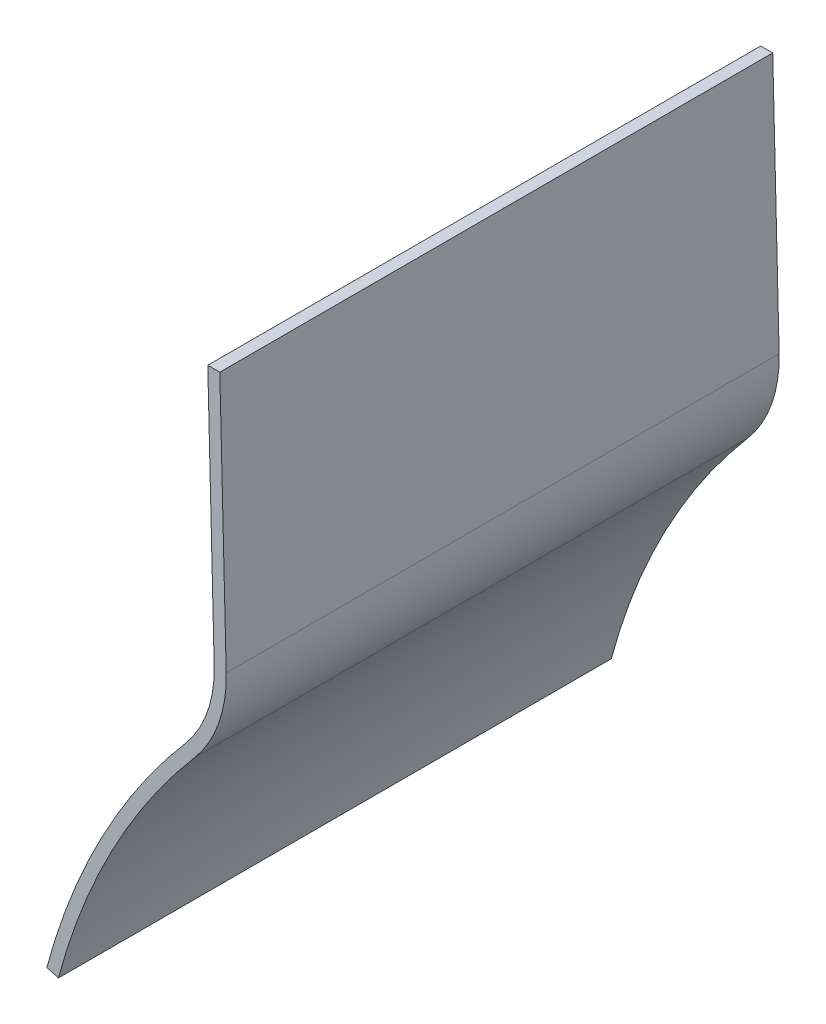
ISO-10303-21;
HEADER;
FILE_DESCRIPTION(('STEP AP214'),'2;1');
FILE_NAME('part.step','',(''),(''),'','','');
FILE_SCHEMA(('AUTOMOTIVE_DESIGN { 1 0 10303 214 1 1 1 1 }'));
ENDSEC;
DATA;
#1=APPLICATION_CONTEXT('core data for automotive mechanical design processes');
#2=APPLICATION_PROTOCOL_DEFINITION('international standard','automotive_design',2000,#1);
#3=PRODUCT_CONTEXT('',#1,'mechanical');
#4=PRODUCT('Part','Part','',(#3));
#5=PRODUCT_RELATED_PRODUCT_CATEGORY('part','',(#4));
#6=PRODUCT_DEFINITION_FORMATION('','',#4);
#7=PRODUCT_DEFINITION_CONTEXT('part definition',#1,'design');
#8=PRODUCT_DEFINITION('design','',#6,#7);
#9=PRODUCT_DEFINITION_SHAPE('','',#8);
#10=(LENGTH_UNIT() NAMED_UNIT(*) SI_UNIT(.MILLI.,.METRE.));
#11=(NAMED_UNIT(*) PLANE_ANGLE_UNIT() SI_UNIT($,.RADIAN.));
#12=(NAMED_UNIT(*) SI_UNIT($,.STERADIAN.) SOLID_ANGLE_UNIT());
#13=UNCERTAINTY_MEASURE_WITH_UNIT(LENGTH_MEASURE(1.E-05),#10,'distance_accuracy_value','');
#14=(GEOMETRIC_REPRESENTATION_CONTEXT(3) GLOBAL_UNCERTAINTY_ASSIGNED_CONTEXT((#13)) GLOBAL_UNIT_ASSIGNED_CONTEXT((#10,
#11,#12)) REPRESENTATION_CONTEXT('',''));
#15=CARTESIAN_POINT('',(0.,0.,0.));
#16=DIRECTION('',(0.,0.,1.));
#17=DIRECTION('',(1.,0.,0.));
#18=AXIS2_PLACEMENT_3D('',#15,#16,#17);
#19=CARTESIAN_POINT('',(3079.9311420539,1803.29085628312,460.));
#20=DIRECTION('',(0.,0.,-1.));
#21=DIRECTION('',(-1.,0.,0.));
#22=AXIS2_PLACEMENT_3D('',#19,#20,#21);
#23=CYLINDRICAL_SURFACE('',#22,549.387659983749);
#24=CARTESIAN_POINT('',(3079.9311420539,1803.29085628312,0.));
#25=DIRECTION('',(0.,0.,-1.));
#26=DIRECTION('',(1.,0.,0.));
#27=AXIS2_PLACEMENT_3D('',#24,#25,#26);
#28=CIRCLE('',#27,549.387659983749);
#29=CARTESIAN_POINT('',(2549.10079832221,1944.8745669144,0.));
#30=VERTEX_POINT('',#29);
#31=CARTESIAN_POINT('',(2662.36569843275,2160.31452669713,0.));
#32=VERTEX_POINT('',#31);
#33=EDGE_CURVE('E113',#30,#32,#28,.T.);
#34=ORIENTED_EDGE('',*,*,#33,.T.);
#35=DIRECTION('',(0.,0.,-1.));
#36=VECTOR('',#35,1.);
#37=CARTESIAN_POINT('',(2662.36569843275,2160.31452669713,460.));
#38=LINE('',#37,#36);
#39=CARTESIAN_POINT('',(2662.36569843275,2160.31452669713,460.));
#40=VERTEX_POINT('',#39);
#41=EDGE_CURVE('E11',#40,#32,#38,.T.);
#42=ORIENTED_EDGE('',*,*,#41,.F.);
#43=CARTESIAN_POINT('',(3079.9311420539,1803.29085628312,460.));
#44=DIRECTION('',(0.,0.,-1.));
#45=DIRECTION('',(1.,0.,0.));
#46=AXIS2_PLACEMENT_3D('',#43,#44,#45);
#47=CIRCLE('',#46,549.387659983749);
#48=CARTESIAN_POINT('',(2549.10079832221,1944.8745669144,460.));
#49=VERTEX_POINT('',#48);
#50=EDGE_CURVE('E127',#49,#40,#47,.T.);
#51=ORIENTED_EDGE('',*,*,#50,.F.);
#52=DIRECTION('',(0.,0.,-1.));
#53=VECTOR('',#52,1.);
#54=CARTESIAN_POINT('',(2549.10079832221,1944.8745669144,460.));
#55=LINE('',#54,#53);
#56=EDGE_CURVE('E109',#49,#30,#55,.T.);
#57=ORIENTED_EDGE('',*,*,#56,.T.);
#58=EDGE_LOOP('',(#34,#42,#51,#57));
#59=FACE_BOUND('',#58,.T.);
#60=ADVANCED_FACE('F17',(#59),#23,.F.);
#61=CARTESIAN_POINT('',(2578.85260970876,2231.71926078022,460.));
#62=DIRECTION('',(0.,0.,-1.));
#63=DIRECTION('',(-1.,0.,0.));
#64=AXIS2_PLACEMENT_3D('',#61,#62,#63);
#65=CYLINDRICAL_SURFACE('',#64,109.877531996749);
#66=CARTESIAN_POINT('',(2578.85260970876,2231.71926078022,0.));
#67=DIRECTION('',(0.,0.,1.));
#68=DIRECTION('',(1.,0.,0.));
#69=AXIS2_PLACEMENT_3D('',#66,#67,#68);
#70=CIRCLE('',#69,109.877531996749);
#71=CARTESIAN_POINT('',(2688.69602440583,2234.45719529106,0.));
#72=VERTEX_POINT('',#71);
#73=EDGE_CURVE('E116',#32,#72,#70,.T.);
#74=ORIENTED_EDGE('',*,*,#73,.T.);
#75=DIRECTION('',(0.,0.,-1.));
#76=VECTOR('',#75,1.);
#77=CARTESIAN_POINT('',(2688.69602440583,2234.45719529106,460.));
#78=LINE('',#77,#76);
#79=CARTESIAN_POINT('',(2688.69602440583,2234.45719529106,460.));
#80=VERTEX_POINT('',#79);
#81=EDGE_CURVE('E25',#80,#72,#78,.T.);
#82=ORIENTED_EDGE('',*,*,#81,.F.);
#83=CARTESIAN_POINT('',(2578.85260970876,2231.71926078022,460.));
#84=DIRECTION('',(0.,0.,1.));
#85=DIRECTION('',(1.,0.,0.));
#86=AXIS2_PLACEMENT_3D('',#83,#84,#85);
#87=CIRCLE('',#86,109.877531996749);
#88=EDGE_CURVE('E76',#40,#80,#87,.T.);
#89=ORIENTED_EDGE('',*,*,#88,.F.);
#90=ORIENTED_EDGE('',*,*,#41,.T.);
#91=EDGE_LOOP('',(#74,#82,#89,#90));
#92=FACE_BOUND('',#91,.T.);
#93=ADVANCED_FACE('F162',(#92),#65,.T.);
#94=CARTESIAN_POINT('',(2683.36118481554,2448.48605359148,460.));
#95=DIRECTION('',(-0.99968949703305,-0.0249180561402349,0.));
#96=DIRECTION('',(0.0249180561402349,-0.99968949703305,0.));
#97=AXIS2_PLACEMENT_3D('',#94,#95,#96);
#98=PLANE('',#97);
#99=DIRECTION('',(-0.0249180561402349,0.99968949703305,0.));
#100=VECTOR('',#99,1.);
#101=CARTESIAN_POINT('',(2683.36118481554,2448.48605359148,0.));
#102=LINE('',#101,#100);
#103=CARTESIAN_POINT('',(2683.36118481554,2448.48605359148,0.));
#104=VERTEX_POINT('',#103);
#105=EDGE_CURVE('E118',#72,#104,#102,.T.);
#106=ORIENTED_EDGE('',*,*,#105,.T.);
#107=DIRECTION('',(0.,0.,-1.));
#108=VECTOR('',#107,1.);
#109=CARTESIAN_POINT('',(2683.36118481554,2448.48605359148,460.));
#110=LINE('',#109,#108);
#111=CARTESIAN_POINT('',(2683.36118481554,2448.48605359148,460.));
#112=VERTEX_POINT('',#111);
#113=EDGE_CURVE('E134',#112,#104,#110,.T.);
#114=ORIENTED_EDGE('',*,*,#113,.F.);
#115=DIRECTION('',(-0.0249180561402349,0.99968949703305,0.));
#116=VECTOR('',#115,1.);
#117=CARTESIAN_POINT('',(2683.36118481554,2448.48605359148,460.));
#118=LINE('',#117,#116);
#119=EDGE_CURVE('E142',#80,#112,#118,.T.);
#120=ORIENTED_EDGE('',*,*,#119,.F.);
#121=ORIENTED_EDGE('',*,*,#81,.T.);
#122=EDGE_LOOP('',(#106,#114,#120,#121));
#123=FACE_BOUND('',#122,.T.);
#124=ADVANCED_FACE('F140',(#123),#98,.F.);
#125=CARTESIAN_POINT('',(2673.35807882145,2448.48605359148,460.));
#126=DIRECTION('',(0.,-1.,0.));
#127=DIRECTION('',(0.,0.,-1.));
#128=AXIS2_PLACEMENT_3D('',#125,#126,#127);
#129=PLANE('',#128);
#130=DIRECTION('',(-1.,0.,0.));
#131=VECTOR('',#130,1.);
#132=CARTESIAN_POINT('',(2673.35807882145,2448.48605359148,0.));
#133=LINE('',#132,#131);
#134=CARTESIAN_POINT('',(2673.35807882145,2448.48605359148,0.));
#135=VERTEX_POINT('',#134);
#136=EDGE_CURVE('E120',#104,#135,#133,.T.);
#137=ORIENTED_EDGE('',*,*,#136,.T.);
#138=DIRECTION('',(0.,0.,-1.));
#139=VECTOR('',#138,1.);
#140=CARTESIAN_POINT('',(2673.35807882145,2448.48605359148,460.));
#141=LINE('',#140,#139);
#142=CARTESIAN_POINT('',(2673.35807882145,2448.48605359148,460.));
#143=VERTEX_POINT('',#142);
#144=EDGE_CURVE('E131',#143,#135,#141,.T.);
#145=ORIENTED_EDGE('',*,*,#144,.F.);
#146=DIRECTION('',(-1.,0.,0.));
#147=VECTOR('',#146,1.);
#148=CARTESIAN_POINT('',(2673.35807882145,2448.48605359148,460.));
#149=LINE('',#148,#147);
#150=EDGE_CURVE('E154',#112,#143,#149,.T.);
#151=ORIENTED_EDGE('',*,*,#150,.F.);
#152=ORIENTED_EDGE('',*,*,#113,.T.);
#153=EDGE_LOOP('',(#137,#145,#151,#152));
#154=FACE_BOUND('',#153,.T.);
#155=ADVANCED_FACE('F150',(#154),#129,.F.);
#156=CARTESIAN_POINT('',(2673.35807882145,2448.48605359148,460.));
#157=DIRECTION('',(0.99968949703305,0.0249180561402345,0.));
#158=DIRECTION('',(-0.0249180561402345,0.99968949703305,0.));
#159=AXIS2_PLACEMENT_3D('',#156,#157,#158);
#160=PLANE('',#159);
#161=DIRECTION('',(0.0249180561402345,-0.99968949703305,0.));
#162=VECTOR('',#161,1.);
#163=CARTESIAN_POINT('',(2673.35807882145,2448.48605359148,0.));
#164=LINE('',#163,#162);
#165=CARTESIAN_POINT('',(2678.69912943549,2234.20801472966,0.));
#166=VERTEX_POINT('',#165);
#167=EDGE_CURVE('E122',#135,#166,#164,.T.);
#168=ORIENTED_EDGE('',*,*,#167,.T.);
#169=DIRECTION('',(0.,0.,-1.));
#170=VECTOR('',#169,1.);
#171=CARTESIAN_POINT('',(2678.69912943549,2234.20801472966,460.));
#172=LINE('',#171,#170);
#173=CARTESIAN_POINT('',(2678.69912943549,2234.20801472966,460.));
#174=VERTEX_POINT('',#173);
#175=EDGE_CURVE('E104',#174,#166,#172,.T.);
#176=ORIENTED_EDGE('',*,*,#175,.F.);
#177=DIRECTION('',(0.0249180561402345,-0.99968949703305,0.));
#178=VECTOR('',#177,1.);
#179=CARTESIAN_POINT('',(2673.35807882145,2448.48605359148,460.));
#180=LINE('',#179,#178);
#181=EDGE_CURVE('E95',#143,#174,#180,.T.);
#182=ORIENTED_EDGE('',*,*,#181,.F.);
#183=ORIENTED_EDGE('',*,*,#144,.T.);
#184=EDGE_LOOP('',(#168,#176,#182,#183));
#185=FACE_BOUND('',#184,.T.);
#186=ADVANCED_FACE('F153',(#185),#160,.F.);
#187=CARTESIAN_POINT('',(2578.85260970876,2231.71926078022,460.));
#188=DIRECTION('',(0.,0.,-1.));
#189=DIRECTION('',(-1.,0.,0.));
#190=AXIS2_PLACEMENT_3D('',#187,#188,#189);
#191=CYLINDRICAL_SURFACE('',#190,99.8775319967491);
#192=CARTESIAN_POINT('',(2578.85260970876,2231.71926078022,0.));
#193=DIRECTION('',(0.,0.,-1.));
#194=DIRECTION('',(1.,0.,0.));
#195=AXIS2_PLACEMENT_3D('',#192,#193,#194);
#196=CIRCLE('',#195,99.8775319967491);
#197=CARTESIAN_POINT('',(2654.76513740752,2166.8131013179,0.));
#198=VERTEX_POINT('',#197);
#199=EDGE_CURVE('E103',#166,#198,#196,.T.);
#200=ORIENTED_EDGE('',*,*,#199,.T.);
#201=DIRECTION('',(0.,0.,-1.));
#202=VECTOR('',#201,1.);
#203=CARTESIAN_POINT('',(2654.76513740752,2166.8131013179,460.));
#204=LINE('',#203,#202);
#205=CARTESIAN_POINT('',(2654.76513740752,2166.8131013179,460.));
#206=VERTEX_POINT('',#205);
#207=EDGE_CURVE('E100',#206,#198,#204,.T.);
#208=ORIENTED_EDGE('',*,*,#207,.F.);
#209=CARTESIAN_POINT('',(2578.85260970876,2231.71926078022,460.));
#210=DIRECTION('',(0.,0.,-1.));
#211=DIRECTION('',(1.,0.,0.));
#212=AXIS2_PLACEMENT_3D('',#209,#210,#211);
#213=CIRCLE('',#212,99.8775319967491);
#214=EDGE_CURVE('E89',#174,#206,#213,.T.);
#215=ORIENTED_EDGE('',*,*,#214,.F.);
#216=ORIENTED_EDGE('',*,*,#175,.T.);
#217=EDGE_LOOP('',(#200,#208,#215,#216));
#218=FACE_BOUND('',#217,.T.);
#219=ADVANCED_FACE('F101',(#218),#191,.F.);
#220=CARTESIAN_POINT('',(3079.9311420539,1803.29085628312,460.));
#221=DIRECTION('',(0.,0.,-1.));
#222=DIRECTION('',(-1.,0.,0.));
#223=AXIS2_PLACEMENT_3D('',#220,#221,#222);
#224=CYLINDRICAL_SURFACE('',#223,559.387659983748);
#225=CARTESIAN_POINT('',(3079.9311420539,1803.29085628312,0.));
#226=DIRECTION('',(0.,0.,1.));
#227=DIRECTION('',(1.,0.,0.));
#228=AXIS2_PLACEMENT_3D('',#225,#226,#227);
#229=CIRCLE('',#228,559.387659983748);
#230=CARTESIAN_POINT('',(2539.48570451849,1947.62824987624,0.));
#231=VERTEX_POINT('',#230);
#232=EDGE_CURVE('E62',#198,#231,#229,.T.);
#233=ORIENTED_EDGE('',*,*,#232,.T.);
#234=DIRECTION('',(0.,0.,-1.));
#235=VECTOR('',#234,1.);
#236=CARTESIAN_POINT('',(2539.48570451849,1947.62824987624,460.));
#237=LINE('',#236,#235);
#238=CARTESIAN_POINT('',(2539.48570451849,1947.62824987624,460.));
#239=VERTEX_POINT('',#238);
#240=EDGE_CURVE('E105',#239,#231,#237,.T.);
#241=ORIENTED_EDGE('',*,*,#240,.F.);
#242=CARTESIAN_POINT('',(3079.9311420539,1803.29085628312,460.));
#243=DIRECTION('',(0.,0.,1.));
#244=DIRECTION('',(1.,0.,0.));
#245=AXIS2_PLACEMENT_3D('',#242,#243,#244);
#246=CIRCLE('',#245,559.387659983748);
#247=EDGE_CURVE('E93',#206,#239,#246,.T.);
#248=ORIENTED_EDGE('',*,*,#247,.F.);
#249=ORIENTED_EDGE('',*,*,#207,.T.);
#250=EDGE_LOOP('',(#233,#241,#248,#249));
#251=FACE_BOUND('',#250,.T.);
#252=ADVANCED_FACE('F107',(#251),#224,.T.);
#253=CARTESIAN_POINT('',(2549.10079832221,1944.8745669144,460.));
#254=DIRECTION('',(0.275323148667391,0.961351737819136,0.));
#255=DIRECTION('',(-0.961351737819136,0.275323148667391,0.));
#256=AXIS2_PLACEMENT_3D('',#253,#254,#255);
#257=PLANE('',#256);
#258=DIRECTION('',(0.961351737819136,-0.275323148667391,0.));
#259=VECTOR('',#258,1.);
#260=CARTESIAN_POINT('',(2549.10079832221,1944.8745669144,0.));
#261=LINE('',#260,#259);
#262=EDGE_CURVE('E68',#231,#30,#261,.T.);
#263=ORIENTED_EDGE('',*,*,#262,.T.);
#264=ORIENTED_EDGE('',*,*,#56,.F.);
#265=DIRECTION('',(0.961351737819136,-0.275323148667391,0.));
#266=VECTOR('',#265,1.);
#267=CARTESIAN_POINT('',(2549.10079832221,1944.8745669144,460.));
#268=LINE('',#267,#266);
#269=EDGE_CURVE('E33',#239,#49,#268,.T.);
#270=ORIENTED_EDGE('',*,*,#269,.F.);
#271=ORIENTED_EDGE('',*,*,#240,.T.);
#272=EDGE_LOOP('',(#263,#264,#270,#271));
#273=FACE_BOUND('',#272,.T.);
#274=ADVANCED_FACE('F180',(#273),#257,.F.);
#275=CARTESIAN_POINT('',(3079.9311420539,1803.29085628312,460.));
#276=DIRECTION('',(0.,0.,1.));
#277=DIRECTION('',(1.,0.,0.));
#278=AXIS2_PLACEMENT_3D('',#275,#276,#277);
#279=PLANE('',#278);
#280=ORIENTED_EDGE('',*,*,#50,.T.);
#281=ORIENTED_EDGE('',*,*,#88,.T.);
#282=ORIENTED_EDGE('',*,*,#119,.T.);
#283=ORIENTED_EDGE('',*,*,#150,.T.);
#284=ORIENTED_EDGE('',*,*,#181,.T.);
#285=ORIENTED_EDGE('',*,*,#214,.T.);
#286=ORIENTED_EDGE('',*,*,#247,.T.);
#287=ORIENTED_EDGE('',*,*,#269,.T.);
#288=EDGE_LOOP('',(#280,#281,#282,#283,#284,#285,#286,#287));
#289=FACE_BOUND('',#288,.T.);
#290=ADVANCED_FACE('F91',(#289),#279,.T.);
#291=CARTESIAN_POINT('',(3079.9311420539,1803.29085628312,0.));
#292=DIRECTION('',(0.,0.,1.));
#293=DIRECTION('',(1.,0.,0.));
#294=AXIS2_PLACEMENT_3D('',#291,#292,#293);
#295=PLANE('',#294);
#296=ORIENTED_EDGE('',*,*,#33,.F.);
#297=ORIENTED_EDGE('',*,*,#262,.F.);
#298=ORIENTED_EDGE('',*,*,#232,.F.);
#299=ORIENTED_EDGE('',*,*,#199,.F.);
#300=ORIENTED_EDGE('',*,*,#167,.F.);
#301=ORIENTED_EDGE('',*,*,#136,.F.);
#302=ORIENTED_EDGE('',*,*,#105,.F.);
#303=ORIENTED_EDGE('',*,*,#73,.F.);
#304=EDGE_LOOP('',(#296,#297,#298,#299,#300,#301,#302,#303));
#305=FACE_BOUND('',#304,.T.);
#306=ADVANCED_FACE('F146',(#305),#295,.F.);
#307=CLOSED_SHELL('',(#60,#93,#124,#155,#186,#219,#252,#274,#290,#306));
#308=MANIFOLD_SOLID_BREP('B1',#307);
#309=ADVANCED_BREP_SHAPE_REPRESENTATION('',(#18,#308),#14);
#310=SHAPE_DEFINITION_REPRESENTATION(#9,#309);
ENDSEC;
END-ISO-10303-21;
